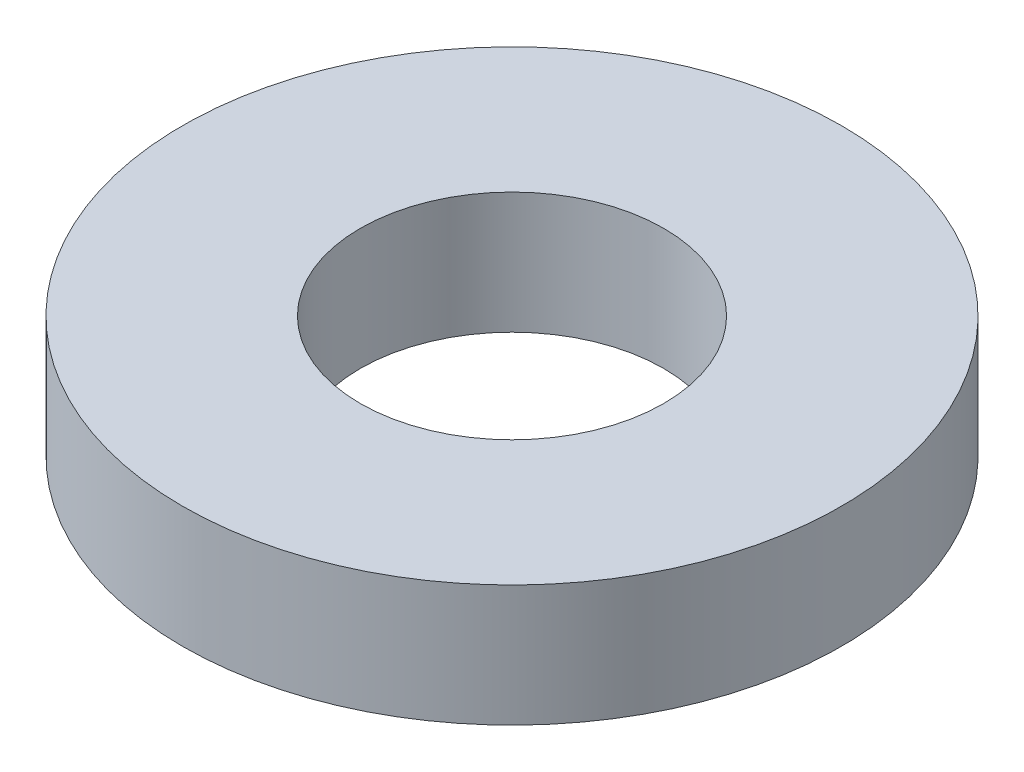
ISO-10303-21;
HEADER;
FILE_DESCRIPTION(('STEP AP214'),'2;1');
FILE_NAME('part.step','',(''),(''),'','','');
FILE_SCHEMA(('AUTOMOTIVE_DESIGN { 1 0 10303 214 1 1 1 1 }'));
ENDSEC;
DATA;
#1=APPLICATION_CONTEXT('core data for automotive mechanical design processes');
#2=APPLICATION_PROTOCOL_DEFINITION('international standard','automotive_design',2000,#1);
#3=PRODUCT_CONTEXT('',#1,'mechanical');
#4=PRODUCT('Part','Part','',(#3));
#5=PRODUCT_RELATED_PRODUCT_CATEGORY('part','',(#4));
#6=PRODUCT_DEFINITION_FORMATION('','',#4);
#7=PRODUCT_DEFINITION_CONTEXT('part definition',#1,'design');
#8=PRODUCT_DEFINITION('design','',#6,#7);
#9=PRODUCT_DEFINITION_SHAPE('','',#8);
#10=(LENGTH_UNIT() NAMED_UNIT(*) SI_UNIT(.MILLI.,.METRE.));
#11=(NAMED_UNIT(*) PLANE_ANGLE_UNIT() SI_UNIT($,.RADIAN.));
#12=(NAMED_UNIT(*) SI_UNIT($,.STERADIAN.) SOLID_ANGLE_UNIT());
#13=UNCERTAINTY_MEASURE_WITH_UNIT(LENGTH_MEASURE(1.E-05),#10,'distance_accuracy_value','');
#14=(GEOMETRIC_REPRESENTATION_CONTEXT(3) GLOBAL_UNCERTAINTY_ASSIGNED_CONTEXT((#13)) GLOBAL_UNIT_ASSIGNED_CONTEXT((#10,
#11,#12)) REPRESENTATION_CONTEXT('',''));
#15=CARTESIAN_POINT('',(0.,0.,0.));
#16=DIRECTION('',(0.,0.,1.));
#17=DIRECTION('',(1.,0.,0.));
#18=AXIS2_PLACEMENT_3D('',#15,#16,#17);
#19=CARTESIAN_POINT('',(0.,2.54,0.));
#20=DIRECTION('',(0.,1.,0.));
#21=DIRECTION('',(0.,0.,1.));
#22=AXIS2_PLACEMENT_3D('',#19,#20,#21);
#23=PLANE('',#22);
#24=CARTESIAN_POINT('',(0.,2.54,0.));
#25=DIRECTION('',(0.,1.,0.));
#26=DIRECTION('',(0.,0.,1.));
#27=AXIS2_PLACEMENT_3D('',#24,#25,#26);
#28=CIRCLE('',#27,6.8961);
#29=CARTESIAN_POINT('',(0.,2.54,6.8961));
#30=VERTEX_POINT('',#29);
#31=EDGE_CURVE('E10',#30,#30,#28,.T.);
#32=ORIENTED_EDGE('',*,*,#31,.T.);
#33=EDGE_LOOP('',(#32));
#34=FACE_BOUND('',#33,.T.);
#35=CARTESIAN_POINT('',(0.,2.54,0.));
#36=DIRECTION('',(0.,1.,0.));
#37=DIRECTION('',(0.,0.,1.));
#38=AXIS2_PLACEMENT_3D('',#35,#36,#37);
#39=CIRCLE('',#38,3.175);
#40=CARTESIAN_POINT('',(0.,2.54,3.175));
#41=VERTEX_POINT('',#40);
#42=EDGE_CURVE('E41',#41,#41,#39,.T.);
#43=ORIENTED_EDGE('',*,*,#42,.F.);
#44=EDGE_LOOP('',(#43));
#45=FACE_BOUND('',#44,.T.);
#46=ADVANCED_FACE('F30',(#34,#45),#23,.T.);
#47=CARTESIAN_POINT('',(0.,0.,0.));
#48=DIRECTION('',(0.,1.,0.));
#49=DIRECTION('',(0.,0.,1.));
#50=AXIS2_PLACEMENT_3D('',#47,#48,#49);
#51=PLANE('',#50);
#52=CARTESIAN_POINT('',(0.,0.,0.));
#53=DIRECTION('',(0.,1.,0.));
#54=DIRECTION('',(0.,0.,1.));
#55=AXIS2_PLACEMENT_3D('',#52,#53,#54);
#56=CIRCLE('',#55,6.8961);
#57=CARTESIAN_POINT('',(0.,0.,6.8961));
#58=VERTEX_POINT('',#57);
#59=EDGE_CURVE('E34',#58,#58,#56,.T.);
#60=ORIENTED_EDGE('',*,*,#59,.F.);
#61=EDGE_LOOP('',(#60));
#62=FACE_BOUND('',#61,.T.);
#63=CARTESIAN_POINT('',(0.,0.,0.));
#64=DIRECTION('',(0.,1.,0.));
#65=DIRECTION('',(0.,0.,1.));
#66=AXIS2_PLACEMENT_3D('',#63,#64,#65);
#67=CIRCLE('',#66,3.175);
#68=CARTESIAN_POINT('',(0.,0.,3.175));
#69=VERTEX_POINT('',#68);
#70=EDGE_CURVE('E43',#69,#69,#67,.T.);
#71=ORIENTED_EDGE('',*,*,#70,.T.);
#72=EDGE_LOOP('',(#71));
#73=FACE_BOUND('',#72,.T.);
#74=ADVANCED_FACE('F53',(#62,#73),#51,.F.);
#75=CARTESIAN_POINT('',(0.,2.54,0.));
#76=DIRECTION('',(0.,-1.,0.));
#77=DIRECTION('',(0.,0.,-1.));
#78=AXIS2_PLACEMENT_3D('',#75,#76,#77);
#79=CYLINDRICAL_SURFACE('',#78,6.8961);
#80=ORIENTED_EDGE('',*,*,#31,.F.);
#81=EDGE_LOOP('',(#80));
#82=FACE_BOUND('',#81,.T.);
#83=ORIENTED_EDGE('',*,*,#59,.T.);
#84=EDGE_LOOP('',(#83));
#85=FACE_BOUND('',#84,.T.);
#86=ADVANCED_FACE('F32',(#82,#85),#79,.T.);
#87=CARTESIAN_POINT('',(0.,2.54,0.));
#88=DIRECTION('',(0.,-1.,0.));
#89=DIRECTION('',(0.,0.,-1.));
#90=AXIS2_PLACEMENT_3D('',#87,#88,#89);
#91=CYLINDRICAL_SURFACE('',#90,3.175);
#92=ORIENTED_EDGE('',*,*,#42,.T.);
#93=EDGE_LOOP('',(#92));
#94=FACE_BOUND('',#93,.T.);
#95=ORIENTED_EDGE('',*,*,#70,.F.);
#96=EDGE_LOOP('',(#95));
#97=FACE_BOUND('',#96,.T.);
#98=ADVANCED_FACE('F49',(#94,#97),#91,.F.);
#99=CLOSED_SHELL('',(#46,#74,#86,#98));
#100=MANIFOLD_SOLID_BREP('B2',#99);
#101=ADVANCED_BREP_SHAPE_REPRESENTATION('',(#18,#100),#14);
#102=SHAPE_DEFINITION_REPRESENTATION(#9,#101);
ENDSEC;
END-ISO-10303-21;
